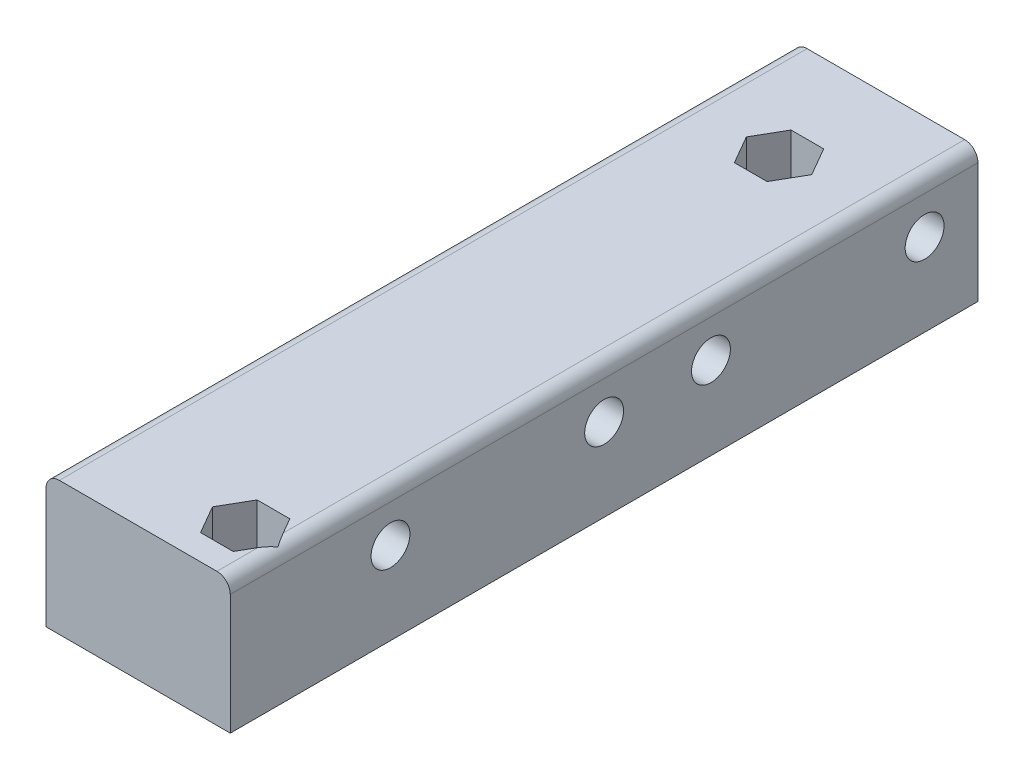
ISO-10303-21;
HEADER;
FILE_DESCRIPTION(('STEP AP214'),'2;1');
FILE_NAME('part.step','',(''),(''),'','','');
FILE_SCHEMA(('AUTOMOTIVE_DESIGN { 1 0 10303 214 1 1 1 1 }'));
ENDSEC;
DATA;
#1=APPLICATION_CONTEXT('core data for automotive mechanical design processes');
#2=APPLICATION_PROTOCOL_DEFINITION('international standard','automotive_design',2000,#1);
#3=PRODUCT_CONTEXT('',#1,'mechanical');
#4=PRODUCT('Part','Part','',(#3));
#5=PRODUCT_RELATED_PRODUCT_CATEGORY('part','',(#4));
#6=PRODUCT_DEFINITION_FORMATION('','',#4);
#7=PRODUCT_DEFINITION_CONTEXT('part definition',#1,'design');
#8=PRODUCT_DEFINITION('design','',#6,#7);
#9=PRODUCT_DEFINITION_SHAPE('','',#8);
#10=(LENGTH_UNIT() NAMED_UNIT(*) SI_UNIT(.MILLI.,.METRE.));
#11=(NAMED_UNIT(*) PLANE_ANGLE_UNIT() SI_UNIT($,.RADIAN.));
#12=(NAMED_UNIT(*) SI_UNIT($,.STERADIAN.) SOLID_ANGLE_UNIT());
#13=UNCERTAINTY_MEASURE_WITH_UNIT(LENGTH_MEASURE(1.E-05),#10,'distance_accuracy_value','');
#14=(GEOMETRIC_REPRESENTATION_CONTEXT(3) GLOBAL_UNCERTAINTY_ASSIGNED_CONTEXT((#13)) GLOBAL_UNIT_ASSIGNED_CONTEXT((#10,
#11,#12)) REPRESENTATION_CONTEXT('',''));
#15=CARTESIAN_POINT('',(0.,0.,0.));
#16=DIRECTION('',(0.,0.,1.));
#17=DIRECTION('',(1.,0.,0.));
#18=AXIS2_PLACEMENT_3D('',#15,#16,#17);
#19=CARTESIAN_POINT('',(0.,15.875,101.6));
#20=DIRECTION('',(0.,-1.,0.));
#21=DIRECTION('',(0.,0.,-1.));
#22=AXIS2_PLACEMENT_3D('',#19,#20,#21);
#23=PLANE('',#22);
#24=DIRECTION('',(-0.5,0.,-0.866025403784438));
#25=VECTOR('',#24,1.);
#26=CARTESIAN_POINT('',(12.896822330935,15.875,22.0345000000065));
#27=LINE('',#26,#25);
#28=CARTESIAN_POINT('',(14.8398946618927,15.875,25.4000000000065));
#29=VERTEX_POINT('',#28);
#30=CARTESIAN_POINT('',(12.896822330935,15.875,22.0345000000065));
#31=VERTEX_POINT('',#30);
#32=EDGE_CURVE('E316',#29,#31,#27,.T.);
#33=ORIENTED_EDGE('',*,*,#32,.F.);
#34=DIRECTION('',(0.5,0.,-0.866025403784439));
#35=VECTOR('',#34,1.);
#36=CARTESIAN_POINT('',(14.8398946618927,15.875,25.4000000000065));
#37=LINE('',#36,#35);
#38=CARTESIAN_POINT('',(12.896822330935,15.875,28.7655000000065));
#39=VERTEX_POINT('',#38);
#40=EDGE_CURVE('E311',#39,#29,#37,.T.);
#41=ORIENTED_EDGE('',*,*,#40,.F.);
#42=DIRECTION('',(1.,0.,0.));
#43=VECTOR('',#42,1.);
#44=CARTESIAN_POINT('',(12.896822330935,15.875,28.7655000000065));
#45=LINE('',#44,#43);
#46=CARTESIAN_POINT('',(9.01067766901965,15.875,28.7655000000065));
#47=VERTEX_POINT('',#46);
#48=EDGE_CURVE('E223',#47,#39,#45,.T.);
#49=ORIENTED_EDGE('',*,*,#48,.F.);
#50=DIRECTION('',(0.5,0.,0.866025403784439));
#51=VECTOR('',#50,1.);
#52=CARTESIAN_POINT('',(9.01067766901965,15.875,28.7655000000065));
#53=LINE('',#52,#51);
#54=CARTESIAN_POINT('',(7.06760533806197,15.875,25.4000000000065));
#55=VERTEX_POINT('',#54);
#56=EDGE_CURVE('E234',#55,#47,#53,.T.);
#57=ORIENTED_EDGE('',*,*,#56,.F.);
#58=DIRECTION('',(-0.5,0.,0.866025403784439));
#59=VECTOR('',#58,1.);
#60=CARTESIAN_POINT('',(7.06760533806197,15.875,25.4000000000065));
#61=LINE('',#60,#59);
#62=CARTESIAN_POINT('',(9.01067766901965,15.875,22.0345000000065));
#63=VERTEX_POINT('',#62);
#64=EDGE_CURVE('E325',#63,#55,#61,.T.);
#65=ORIENTED_EDGE('',*,*,#64,.F.);
#66=DIRECTION('',(-1.,0.,0.));
#67=VECTOR('',#66,1.);
#68=CARTESIAN_POINT('',(9.01067766901965,15.875,22.0345000000065));
#69=LINE('',#68,#67);
#70=EDGE_CURVE('E317',#31,#63,#69,.T.);
#71=ORIENTED_EDGE('',*,*,#70,.F.);
#72=EDGE_LOOP('',(#33,#41,#49,#57,#65,#71));
#73=FACE_BOUND('',#72,.T.);
#74=DIRECTION('',(1.,0.,0.));
#75=VECTOR('',#74,1.);
#76=CARTESIAN_POINT('',(21.9075,15.875,12.7));
#77=LINE('',#76,#75);
#78=CARTESIAN_POINT('',(1.5875,15.875,12.7));
#79=VERTEX_POINT('',#78);
#80=CARTESIAN_POINT('',(20.32,15.875,12.7));
#81=VERTEX_POINT('',#80);
#82=EDGE_CURVE('E217',#79,#81,#77,.T.);
#83=ORIENTED_EDGE('',*,*,#82,.F.);
#84=DIRECTION('',(0.,0.,-1.));
#85=VECTOR('',#84,1.);
#86=CARTESIAN_POINT('',(1.5875,15.875,101.6));
#87=LINE('',#86,#85);
#88=CARTESIAN_POINT('',(1.5875,15.875,101.6));
#89=VERTEX_POINT('',#88);
#90=EDGE_CURVE('E194',#79,#89,#87,.F.);
#91=ORIENTED_EDGE('',*,*,#90,.T.);
#92=DIRECTION('',(-1.,0.,0.));
#93=VECTOR('',#92,1.);
#94=CARTESIAN_POINT('',(0.,15.875,101.6));
#95=LINE('',#94,#93);
#96=CARTESIAN_POINT('',(20.32,15.875,101.6));
#97=VERTEX_POINT('',#96);
#98=EDGE_CURVE('E186',#97,#89,#95,.T.);
#99=ORIENTED_EDGE('',*,*,#98,.F.);
#100=DIRECTION('',(0.,0.,-1.));
#101=VECTOR('',#100,1.);
#102=CARTESIAN_POINT('',(20.32,15.875,101.6));
#103=LINE('',#102,#101);
#104=CARTESIAN_POINT('',(20.32,15.875,96.7300317515454));
#105=VERTEX_POINT('',#104);
#106=EDGE_CURVE('E199',#97,#105,#103,.T.);
#107=ORIENTED_EDGE('',*,*,#106,.T.);
#108=DIRECTION('',(0.5,0.,-0.866025403784439));
#109=VECTOR('',#108,1.);
#110=CARTESIAN_POINT('',(21.1898946618799,15.875,95.2233299999364));
#111=LINE('',#110,#109);
#112=CARTESIAN_POINT('',(19.2468223309222,15.875,98.5888299999364));
#113=VERTEX_POINT('',#112);
#114=EDGE_CURVE('E242',#113,#105,#111,.T.);
#115=ORIENTED_EDGE('',*,*,#114,.F.);
#116=DIRECTION('',(1.,0.,0.));
#117=VECTOR('',#116,1.);
#118=CARTESIAN_POINT('',(19.2468223309222,15.875,98.5888299999364));
#119=LINE('',#118,#117);
#120=CARTESIAN_POINT('',(15.3606776690069,15.875,98.5888299999364));
#121=VERTEX_POINT('',#120);
#122=EDGE_CURVE('E264',#121,#113,#119,.T.);
#123=ORIENTED_EDGE('',*,*,#122,.F.);
#124=DIRECTION('',(0.500000000000001,0.,0.866025403784438));
#125=VECTOR('',#124,1.);
#126=CARTESIAN_POINT('',(15.3606776690069,15.875,98.5888299999364));
#127=LINE('',#126,#125);
#128=CARTESIAN_POINT('',(13.4176053380492,15.875,95.2233299999365));
#129=VERTEX_POINT('',#128);
#130=EDGE_CURVE('E229',#129,#121,#127,.T.);
#131=ORIENTED_EDGE('',*,*,#130,.F.);
#132=DIRECTION('',(-0.5,0.,0.866025403784439));
#133=VECTOR('',#132,1.);
#134=CARTESIAN_POINT('',(13.4176053380492,15.875,95.2233299999365));
#135=LINE('',#134,#133);
#136=CARTESIAN_POINT('',(15.3606776690069,15.875,91.8578299999364));
#137=VERTEX_POINT('',#136);
#138=EDGE_CURVE('E232',#137,#129,#135,.T.);
#139=ORIENTED_EDGE('',*,*,#138,.F.);
#140=DIRECTION('',(-1.,0.,0.));
#141=VECTOR('',#140,1.);
#142=CARTESIAN_POINT('',(15.3606776690069,15.875,91.8578299999364));
#143=LINE('',#142,#141);
#144=CARTESIAN_POINT('',(19.2468223309222,15.875,91.8578299999364));
#145=VERTEX_POINT('',#144);
#146=EDGE_CURVE('E233',#145,#137,#143,.T.);
#147=ORIENTED_EDGE('',*,*,#146,.F.);
#148=DIRECTION('',(-0.5,0.,-0.866025403784439));
#149=VECTOR('',#148,1.);
#150=CARTESIAN_POINT('',(19.2468223309222,15.875,91.8578299999364));
#151=LINE('',#150,#149);
#152=CARTESIAN_POINT('',(20.32,15.875,93.7166282483275));
#153=VERTEX_POINT('',#152);
#154=EDGE_CURVE('E236',#153,#145,#151,.T.);
#155=ORIENTED_EDGE('',*,*,#154,.F.);
#156=EDGE_CURVE('E200',#153,#81,#103,.T.);
#157=ORIENTED_EDGE('',*,*,#156,.T.);
#158=EDGE_LOOP('',(#83,#91,#99,#107,#115,#123,#131,#139,#147,#155,#157));
#159=FACE_BOUND('',#158,.T.);
#160=ADVANCED_FACE('F39',(#73,#159),#23,.F.);
#161=CARTESIAN_POINT('',(0.,0.,101.6));
#162=DIRECTION('',(1.,0.,0.));
#163=DIRECTION('',(0.,0.,-1.));
#164=AXIS2_PLACEMENT_3D('',#161,#162,#163);
#165=PLANE('',#164);
#166=CARTESIAN_POINT('',(0.,9.82980000007019,19.0500000000115));
#167=DIRECTION('',(1.,0.,0.));
#168=DIRECTION('',(0.,0.,-1.));
#169=AXIS2_PLACEMENT_3D('',#166,#167,#168);
#170=CIRCLE('',#169,2.31139999999998);
#171=CARTESIAN_POINT('',(0.,9.82980000007019,16.7386000000115));
#172=VERTEX_POINT('',#171);
#173=EDGE_CURVE('E347',#172,#172,#170,.F.);
#174=ORIENTED_EDGE('',*,*,#173,.F.);
#175=EDGE_LOOP('',(#174));
#176=FACE_BOUND('',#175,.T.);
#177=CARTESIAN_POINT('',(0.,9.82980000007019,82.5500000000114));
#178=DIRECTION('',(1.,0.,0.));
#179=DIRECTION('',(0.,0.,-1.));
#180=AXIS2_PLACEMENT_3D('',#177,#178,#179);
#181=CIRCLE('',#180,2.3114);
#182=CARTESIAN_POINT('',(0.,9.82980000007019,80.2386000000114));
#183=VERTEX_POINT('',#182);
#184=EDGE_CURVE('E278',#183,#183,#181,.F.);
#185=ORIENTED_EDGE('',*,*,#184,.F.);
#186=EDGE_LOOP('',(#185));
#187=FACE_BOUND('',#186,.T.);
#188=CARTESIAN_POINT('',(0.,9.82980000007019,44.4500000000115));
#189=DIRECTION('',(1.,0.,0.));
#190=DIRECTION('',(0.,0.,-1.));
#191=AXIS2_PLACEMENT_3D('',#188,#189,#190);
#192=CIRCLE('',#191,2.31139999999998);
#193=CARTESIAN_POINT('',(0.,9.82980000007019,42.1386000000115));
#194=VERTEX_POINT('',#193);
#195=EDGE_CURVE('E332',#194,#194,#192,.F.);
#196=ORIENTED_EDGE('',*,*,#195,.F.);
#197=EDGE_LOOP('',(#196));
#198=FACE_BOUND('',#197,.T.);
#199=CARTESIAN_POINT('',(0.,9.82980000007019,57.1500000000115));
#200=DIRECTION('',(1.,0.,0.));
#201=DIRECTION('',(0.,0.,-1.));
#202=AXIS2_PLACEMENT_3D('',#199,#200,#201);
#203=CIRCLE('',#202,2.31139999999998);
#204=CARTESIAN_POINT('',(0.,9.82980000007019,54.8386000000115));
#205=VERTEX_POINT('',#204);
#206=EDGE_CURVE('E335',#205,#205,#203,.F.);
#207=ORIENTED_EDGE('',*,*,#206,.F.);
#208=EDGE_LOOP('',(#207));
#209=FACE_BOUND('',#208,.T.);
#210=DIRECTION('',(0.,1.,0.));
#211=VECTOR('',#210,1.);
#212=CARTESIAN_POINT('',(0.,0.,12.7));
#213=LINE('',#212,#211);
#214=CARTESIAN_POINT('',(0.,0.,12.7));
#215=VERTEX_POINT('',#214);
#216=CARTESIAN_POINT('',(0.,14.2875,12.7));
#217=VERTEX_POINT('',#216);
#218=EDGE_CURVE('E52',#215,#217,#213,.T.);
#219=ORIENTED_EDGE('',*,*,#218,.F.);
#220=DIRECTION('',(0.,0.,-1.));
#221=VECTOR('',#220,1.);
#222=CARTESIAN_POINT('',(0.,0.,101.6));
#223=LINE('',#222,#221);
#224=CARTESIAN_POINT('',(0.,0.,101.6));
#225=VERTEX_POINT('',#224);
#226=EDGE_CURVE('E183',#225,#215,#223,.T.);
#227=ORIENTED_EDGE('',*,*,#226,.F.);
#228=DIRECTION('',(0.,-1.,0.));
#229=VECTOR('',#228,1.);
#230=CARTESIAN_POINT('',(0.,0.,101.6));
#231=LINE('',#230,#229);
#232=CARTESIAN_POINT('',(0.,14.2875,101.6));
#233=VERTEX_POINT('',#232);
#234=EDGE_CURVE('E213',#233,#225,#231,.T.);
#235=ORIENTED_EDGE('',*,*,#234,.F.);
#236=DIRECTION('',(0.,0.,-1.));
#237=VECTOR('',#236,1.);
#238=CARTESIAN_POINT('',(0.,14.2875,101.6));
#239=LINE('',#238,#237);
#240=EDGE_CURVE('E50',#233,#217,#239,.T.);
#241=ORIENTED_EDGE('',*,*,#240,.T.);
#242=EDGE_LOOP('',(#219,#227,#235,#241));
#243=FACE_BOUND('',#242,.T.);
#244=ADVANCED_FACE('F215',(#176,#187,#198,#209,#243),#165,.F.);
#245=CARTESIAN_POINT('',(0.,0.,101.6));
#246=DIRECTION('',(0.,1.,0.));
#247=DIRECTION('',(0.,0.,1.));
#248=AXIS2_PLACEMENT_3D('',#245,#246,#247);
#249=PLANE('',#248);
#250=DIRECTION('',(-1.,0.,0.));
#251=VECTOR('',#250,1.);
#252=CARTESIAN_POINT('',(12.896822330935,0.,28.7655000000065));
#253=LINE('',#252,#251);
#254=CARTESIAN_POINT('',(12.896822330935,0.,28.7655000000065));
#255=VERTEX_POINT('',#254);
#256=CARTESIAN_POINT('',(9.01067766901965,0.,28.7655000000065));
#257=VERTEX_POINT('',#256);
#258=EDGE_CURVE('E306',#255,#257,#253,.T.);
#259=ORIENTED_EDGE('',*,*,#258,.F.);
#260=DIRECTION('',(-0.5,0.,0.866025403784439));
#261=VECTOR('',#260,1.);
#262=CARTESIAN_POINT('',(14.8398946618927,0.,25.4000000000065));
#263=LINE('',#262,#261);
#264=CARTESIAN_POINT('',(14.8398946618927,0.,25.4000000000065));
#265=VERTEX_POINT('',#264);
#266=EDGE_CURVE('E313',#265,#255,#263,.T.);
#267=ORIENTED_EDGE('',*,*,#266,.F.);
#268=DIRECTION('',(0.5,0.,0.866025403784438));
#269=VECTOR('',#268,1.);
#270=CARTESIAN_POINT('',(12.896822330935,0.,22.0345000000065));
#271=LINE('',#270,#269);
#272=CARTESIAN_POINT('',(12.896822330935,0.,22.0345000000065));
#273=VERTEX_POINT('',#272);
#274=EDGE_CURVE('E289',#273,#265,#271,.T.);
#275=ORIENTED_EDGE('',*,*,#274,.F.);
#276=DIRECTION('',(1.,0.,0.));
#277=VECTOR('',#276,1.);
#278=CARTESIAN_POINT('',(9.01067766901965,0.,22.0345000000065));
#279=LINE('',#278,#277);
#280=CARTESIAN_POINT('',(9.01067766901965,0.,22.0345000000065));
#281=VERTEX_POINT('',#280);
#282=EDGE_CURVE('E299',#281,#273,#279,.T.);
#283=ORIENTED_EDGE('',*,*,#282,.F.);
#284=DIRECTION('',(0.5,0.,-0.866025403784439));
#285=VECTOR('',#284,1.);
#286=CARTESIAN_POINT('',(7.06760533806197,0.,25.4000000000065));
#287=LINE('',#286,#285);
#288=CARTESIAN_POINT('',(7.06760533806197,0.,25.4000000000065));
#289=VERTEX_POINT('',#288);
#290=EDGE_CURVE('E304',#289,#281,#287,.T.);
#291=ORIENTED_EDGE('',*,*,#290,.F.);
#292=DIRECTION('',(-0.5,0.,-0.866025403784439));
#293=VECTOR('',#292,1.);
#294=CARTESIAN_POINT('',(9.01067766901965,0.,28.7655000000065));
#295=LINE('',#294,#293);
#296=EDGE_CURVE('E303',#257,#289,#295,.T.);
#297=ORIENTED_EDGE('',*,*,#296,.F.);
#298=EDGE_LOOP('',(#259,#267,#275,#283,#291,#297));
#299=FACE_BOUND('',#298,.T.);
#300=DIRECTION('',(0.5,0.,0.866025403784439));
#301=VECTOR('',#300,1.);
#302=CARTESIAN_POINT('',(19.2468223309222,0.,91.8578299999364));
#303=LINE('',#302,#301);
#304=CARTESIAN_POINT('',(19.2468223309222,0.,91.8578299999364));
#305=VERTEX_POINT('',#304);
#306=CARTESIAN_POINT('',(21.1898946618799,0.,95.2233299999364));
#307=VERTEX_POINT('',#306);
#308=EDGE_CURVE('E259',#305,#307,#303,.T.);
#309=ORIENTED_EDGE('',*,*,#308,.F.);
#310=DIRECTION('',(1.,0.,0.));
#311=VECTOR('',#310,1.);
#312=CARTESIAN_POINT('',(15.3606776690069,0.,91.8578299999364));
#313=LINE('',#312,#311);
#314=CARTESIAN_POINT('',(15.3606776690069,0.,91.8578299999364));
#315=VERTEX_POINT('',#314);
#316=EDGE_CURVE('E62',#315,#305,#313,.T.);
#317=ORIENTED_EDGE('',*,*,#316,.F.);
#318=DIRECTION('',(0.499999999999999,0.,-0.866025403784439));
#319=VECTOR('',#318,1.);
#320=CARTESIAN_POINT('',(13.4176053380492,0.,95.2233299999365));
#321=LINE('',#320,#319);
#322=CARTESIAN_POINT('',(13.4176053380492,0.,95.2233299999365));
#323=VERTEX_POINT('',#322);
#324=EDGE_CURVE('E254',#323,#315,#321,.T.);
#325=ORIENTED_EDGE('',*,*,#324,.F.);
#326=DIRECTION('',(-0.500000000000001,0.,-0.866025403784438));
#327=VECTOR('',#326,1.);
#328=CARTESIAN_POINT('',(15.3606776690069,0.,98.5888299999364));
#329=LINE('',#328,#327);
#330=CARTESIAN_POINT('',(15.3606776690069,0.,98.5888299999364));
#331=VERTEX_POINT('',#330);
#332=EDGE_CURVE('E252',#331,#323,#329,.T.);
#333=ORIENTED_EDGE('',*,*,#332,.F.);
#334=DIRECTION('',(-1.,0.,0.));
#335=VECTOR('',#334,1.);
#336=CARTESIAN_POINT('',(19.2468223309222,0.,98.5888299999364));
#337=LINE('',#336,#335);
#338=CARTESIAN_POINT('',(19.2468223309222,0.,98.5888299999364));
#339=VERTEX_POINT('',#338);
#340=EDGE_CURVE('E246',#339,#331,#337,.T.);
#341=ORIENTED_EDGE('',*,*,#340,.F.);
#342=DIRECTION('',(-0.5,0.,0.866025403784439));
#343=VECTOR('',#342,1.);
#344=CARTESIAN_POINT('',(21.1898946618799,0.,95.2233299999364));
#345=LINE('',#344,#343);
#346=EDGE_CURVE('E247',#307,#339,#345,.T.);
#347=ORIENTED_EDGE('',*,*,#346,.F.);
#348=EDGE_LOOP('',(#309,#317,#325,#333,#341,#347));
#349=FACE_BOUND('',#348,.T.);
#350=DIRECTION('',(-1.,0.,0.));
#351=VECTOR('',#350,1.);
#352=CARTESIAN_POINT('',(21.9075,0.,12.7));
#353=LINE('',#352,#351);
#354=CARTESIAN_POINT('',(21.9075,0.,12.7));
#355=VERTEX_POINT('',#354);
#356=EDGE_CURVE('E168',#355,#215,#353,.T.);
#357=ORIENTED_EDGE('',*,*,#356,.F.);
#358=DIRECTION('',(0.,0.,-1.));
#359=VECTOR('',#358,1.);
#360=CARTESIAN_POINT('',(21.9075,0.,101.6));
#361=LINE('',#360,#359);
#362=CARTESIAN_POINT('',(21.9075,0.,101.6));
#363=VERTEX_POINT('',#362);
#364=EDGE_CURVE('E185',#363,#355,#361,.T.);
#365=ORIENTED_EDGE('',*,*,#364,.F.);
#366=DIRECTION('',(1.,0.,0.));
#367=VECTOR('',#366,1.);
#368=CARTESIAN_POINT('',(0.,0.,101.6));
#369=LINE('',#368,#367);
#370=EDGE_CURVE('E348',#225,#363,#369,.T.);
#371=ORIENTED_EDGE('',*,*,#370,.F.);
#372=ORIENTED_EDGE('',*,*,#226,.T.);
#373=EDGE_LOOP('',(#357,#365,#371,#372));
#374=FACE_BOUND('',#373,.T.);
#375=ADVANCED_FACE('F178',(#299,#349,#374),#249,.F.);
#376=CARTESIAN_POINT('',(21.9075,0.,101.6));
#377=DIRECTION('',(-1.,0.,0.));
#378=DIRECTION('',(0.,0.,1.));
#379=AXIS2_PLACEMENT_3D('',#376,#377,#378);
#380=PLANE('',#379);
#381=CARTESIAN_POINT('',(21.9075,9.82980000007019,19.0500000000115));
#382=DIRECTION('',(1.,0.,0.));
#383=DIRECTION('',(0.,0.,-1.));
#384=AXIS2_PLACEMENT_3D('',#381,#382,#383);
#385=CIRCLE('',#384,2.31139999999998);
#386=CARTESIAN_POINT('',(21.9075,9.82980000007019,16.7386000000115));
#387=VERTEX_POINT('',#386);
#388=EDGE_CURVE('E339',#387,#387,#385,.T.);
#389=ORIENTED_EDGE('',*,*,#388,.F.);
#390=EDGE_LOOP('',(#389));
#391=FACE_BOUND('',#390,.T.);
#392=CARTESIAN_POINT('',(21.9075,9.82980000007019,82.5500000000114));
#393=DIRECTION('',(1.,0.,0.));
#394=DIRECTION('',(0.,0.,-1.));
#395=AXIS2_PLACEMENT_3D('',#392,#393,#394);
#396=CIRCLE('',#395,2.3114);
#397=CARTESIAN_POINT('',(21.9075,9.82980000007019,80.2386000000114));
#398=VERTEX_POINT('',#397);
#399=EDGE_CURVE('E327',#398,#398,#396,.T.);
#400=ORIENTED_EDGE('',*,*,#399,.F.);
#401=EDGE_LOOP('',(#400));
#402=FACE_BOUND('',#401,.T.);
#403=CARTESIAN_POINT('',(21.9075,9.82980000007019,44.4500000000115));
#404=DIRECTION('',(1.,0.,0.));
#405=DIRECTION('',(0.,0.,-1.));
#406=AXIS2_PLACEMENT_3D('',#403,#404,#405);
#407=CIRCLE('',#406,2.31139999999998);
#408=CARTESIAN_POINT('',(21.9075,9.82980000007019,42.1386000000115));
#409=VERTEX_POINT('',#408);
#410=EDGE_CURVE('E337',#409,#409,#407,.T.);
#411=ORIENTED_EDGE('',*,*,#410,.F.);
#412=EDGE_LOOP('',(#411));
#413=FACE_BOUND('',#412,.T.);
#414=CARTESIAN_POINT('',(21.9075,9.82980000007019,57.1500000000115));
#415=DIRECTION('',(1.,0.,0.));
#416=DIRECTION('',(0.,0.,-1.));
#417=AXIS2_PLACEMENT_3D('',#414,#415,#416);
#418=CIRCLE('',#417,2.31139999999998);
#419=CARTESIAN_POINT('',(21.9075,9.82980000007019,54.8386000000115));
#420=VERTEX_POINT('',#419);
#421=EDGE_CURVE('E333',#420,#420,#418,.T.);
#422=ORIENTED_EDGE('',*,*,#421,.F.);
#423=EDGE_LOOP('',(#422));
#424=FACE_BOUND('',#423,.T.);
#425=DIRECTION('',(0.,-1.,0.));
#426=VECTOR('',#425,1.);
#427=CARTESIAN_POINT('',(21.9075,0.,12.7));
#428=LINE('',#427,#426);
#429=CARTESIAN_POINT('',(21.9075,14.2875,12.7));
#430=VERTEX_POINT('',#429);
#431=EDGE_CURVE('E170',#430,#355,#428,.T.);
#432=ORIENTED_EDGE('',*,*,#431,.F.);
#433=DIRECTION('',(0.,0.,-1.));
#434=VECTOR('',#433,1.);
#435=CARTESIAN_POINT('',(21.9075,14.2875,101.6));
#436=LINE('',#435,#434);
#437=CARTESIAN_POINT('',(21.9075,14.2875,101.6));
#438=VERTEX_POINT('',#437);
#439=EDGE_CURVE('E201',#430,#438,#436,.F.);
#440=ORIENTED_EDGE('',*,*,#439,.T.);
#441=DIRECTION('',(0.,1.,0.));
#442=VECTOR('',#441,1.);
#443=CARTESIAN_POINT('',(21.9075,0.,101.6));
#444=LINE('',#443,#442);
#445=EDGE_CURVE('E189',#363,#438,#444,.T.);
#446=ORIENTED_EDGE('',*,*,#445,.F.);
#447=ORIENTED_EDGE('',*,*,#364,.T.);
#448=EDGE_LOOP('',(#432,#440,#446,#447));
#449=FACE_BOUND('',#448,.T.);
#450=ADVANCED_FACE('F190',(#391,#402,#413,#424,#449),#380,.F.);
#451=CARTESIAN_POINT('',(20.32,14.2875,101.6));
#452=DIRECTION('',(0.,0.,-1.));
#453=DIRECTION('',(-1.,0.,0.));
#454=AXIS2_PLACEMENT_3D('',#451,#452,#453);
#455=CYLINDRICAL_SURFACE('',#454,1.5875);
#456=CARTESIAN_POINT('',(20.32,14.2875,12.7));
#457=DIRECTION('',(0.,0.,1.));
#458=DIRECTION('',(1.,0.,0.));
#459=AXIS2_PLACEMENT_3D('',#456,#457,#458);
#460=CIRCLE('',#459,1.5875);
#461=EDGE_CURVE('E175',#81,#430,#460,.F.);
#462=ORIENTED_EDGE('',*,*,#461,.F.);
#463=ORIENTED_EDGE('',*,*,#156,.F.);
#464=CARTESIAN_POINT('',(20.32,14.2875,93.7166282483275));
#465=DIRECTION('',(0.866025403784439,0.,-0.5));
#466=DIRECTION('',(-0.5,0.,-0.866025403784439));
#467=AXIS2_PLACEMENT_3D('',#464,#465,#466);
#468=ELLIPSE('',#467,3.175,1.5875);
#469=CARTESIAN_POINT('',(21.1898946618799,15.6154456040188,95.2233299999364));
#470=VERTEX_POINT('',#469);
#471=EDGE_CURVE('E280',#153,#470,#468,.T.);
#472=ORIENTED_EDGE('',*,*,#471,.T.);
#473=CARTESIAN_POINT('',(20.32,14.2875,96.7300317515454));
#474=DIRECTION('',(0.866025403784439,0.,0.5));
#475=DIRECTION('',(0.5,0.,-0.866025403784439));
#476=AXIS2_PLACEMENT_3D('',#473,#474,#475);
#477=ELLIPSE('',#476,3.175,1.5875);
#478=EDGE_CURVE('E243',#470,#105,#477,.T.);
#479=ORIENTED_EDGE('',*,*,#478,.T.);
#480=ORIENTED_EDGE('',*,*,#106,.F.);
#481=CARTESIAN_POINT('',(20.32,14.2875,101.6));
#482=DIRECTION('',(0.,0.,-1.));
#483=DIRECTION('',(-1.,0.,0.));
#484=AXIS2_PLACEMENT_3D('',#481,#482,#483);
#485=CIRCLE('',#484,1.5875);
#486=EDGE_CURVE('E210',#438,#97,#485,.F.);
#487=ORIENTED_EDGE('',*,*,#486,.F.);
#488=ORIENTED_EDGE('',*,*,#439,.F.);
#489=EDGE_LOOP('',(#462,#463,#472,#479,#480,#487,#488));
#490=FACE_BOUND('',#489,.T.);
#491=ADVANCED_FACE('F357',(#490),#455,.T.);
#492=CARTESIAN_POINT('',(0.,0.,101.6));
#493=DIRECTION('',(0.,0.,-1.));
#494=DIRECTION('',(-1.,0.,0.));
#495=AXIS2_PLACEMENT_3D('',#492,#493,#494);
#496=PLANE('',#495);
#497=ORIENTED_EDGE('',*,*,#445,.T.);
#498=ORIENTED_EDGE('',*,*,#486,.T.);
#499=ORIENTED_EDGE('',*,*,#98,.T.);
#500=CARTESIAN_POINT('',(1.5875,14.2875,101.6));
#501=DIRECTION('',(0.,0.,-1.));
#502=DIRECTION('',(-1.,0.,0.));
#503=AXIS2_PLACEMENT_3D('',#500,#501,#502);
#504=CIRCLE('',#503,1.5875);
#505=EDGE_CURVE('E202',#89,#233,#504,.F.);
#506=ORIENTED_EDGE('',*,*,#505,.T.);
#507=ORIENTED_EDGE('',*,*,#234,.T.);
#508=ORIENTED_EDGE('',*,*,#370,.T.);
#509=EDGE_LOOP('',(#497,#498,#499,#506,#507,#508));
#510=FACE_BOUND('',#509,.T.);
#511=ADVANCED_FACE('F353',(#510),#496,.F.);
#512=CARTESIAN_POINT('',(1.5875,14.2875,101.6));
#513=DIRECTION('',(0.,0.,-1.));
#514=DIRECTION('',(-1.,0.,0.));
#515=AXIS2_PLACEMENT_3D('',#512,#513,#514);
#516=CYLINDRICAL_SURFACE('',#515,1.5875);
#517=CARTESIAN_POINT('',(1.5875,14.2875,12.7));
#518=DIRECTION('',(0.,0.,1.));
#519=DIRECTION('',(1.,0.,0.));
#520=AXIS2_PLACEMENT_3D('',#517,#518,#519);
#521=CIRCLE('',#520,1.5875);
#522=EDGE_CURVE('E11',#217,#79,#521,.F.);
#523=ORIENTED_EDGE('',*,*,#522,.F.);
#524=ORIENTED_EDGE('',*,*,#240,.F.);
#525=ORIENTED_EDGE('',*,*,#505,.F.);
#526=ORIENTED_EDGE('',*,*,#90,.F.);
#527=EDGE_LOOP('',(#523,#524,#525,#526));
#528=FACE_BOUND('',#527,.T.);
#529=ADVANCED_FACE('F41',(#528),#516,.T.);
#530=CARTESIAN_POINT('',(-6.53762645613833,9.82980000007019,19.0500000000115));
#531=DIRECTION('',(1.,0.,0.));
#532=DIRECTION('',(0.,0.,-1.));
#533=AXIS2_PLACEMENT_3D('',#530,#531,#532);
#534=CYLINDRICAL_SURFACE('',#533,2.31139999999998);
#535=ORIENTED_EDGE('',*,*,#173,.T.);
#536=EDGE_LOOP('',(#535));
#537=FACE_BOUND('',#536,.T.);
#538=ORIENTED_EDGE('',*,*,#388,.T.);
#539=EDGE_LOOP('',(#538));
#540=FACE_BOUND('',#539,.T.);
#541=ADVANCED_FACE('F401',(#537,#540),#534,.F.);
#542=CARTESIAN_POINT('',(-6.53762645613833,9.82980000007019,82.5500000000114));
#543=DIRECTION('',(1.,0.,0.));
#544=DIRECTION('',(0.,0.,-1.));
#545=AXIS2_PLACEMENT_3D('',#542,#543,#544);
#546=CYLINDRICAL_SURFACE('',#545,2.3114);
#547=ORIENTED_EDGE('',*,*,#184,.T.);
#548=EDGE_LOOP('',(#547));
#549=FACE_BOUND('',#548,.T.);
#550=ORIENTED_EDGE('',*,*,#399,.T.);
#551=EDGE_LOOP('',(#550));
#552=FACE_BOUND('',#551,.T.);
#553=ADVANCED_FACE('F407',(#549,#552),#546,.F.);
#554=CARTESIAN_POINT('',(-6.53762645613833,9.82980000007019,44.4500000000115));
#555=DIRECTION('',(1.,0.,0.));
#556=DIRECTION('',(0.,0.,-1.));
#557=AXIS2_PLACEMENT_3D('',#554,#555,#556);
#558=CYLINDRICAL_SURFACE('',#557,2.31139999999998);
#559=ORIENTED_EDGE('',*,*,#195,.T.);
#560=EDGE_LOOP('',(#559));
#561=FACE_BOUND('',#560,.T.);
#562=ORIENTED_EDGE('',*,*,#410,.T.);
#563=EDGE_LOOP('',(#562));
#564=FACE_BOUND('',#563,.T.);
#565=ADVANCED_FACE('F408',(#561,#564),#558,.F.);
#566=CARTESIAN_POINT('',(-6.53762645613833,9.82980000007019,57.1500000000115));
#567=DIRECTION('',(1.,0.,0.));
#568=DIRECTION('',(0.,0.,-1.));
#569=AXIS2_PLACEMENT_3D('',#566,#567,#568);
#570=CYLINDRICAL_SURFACE('',#569,2.31139999999998);
#571=ORIENTED_EDGE('',*,*,#206,.T.);
#572=EDGE_LOOP('',(#571));
#573=FACE_BOUND('',#572,.T.);
#574=ORIENTED_EDGE('',*,*,#421,.T.);
#575=EDGE_LOOP('',(#574));
#576=FACE_BOUND('',#575,.T.);
#577=ADVANCED_FACE('F412',(#573,#576),#570,.F.);
#578=CARTESIAN_POINT('',(14.8398946618927,15.876,25.4000000000065));
#579=DIRECTION('',(0.866025403784439,0.,0.5));
#580=DIRECTION('',(0.5,0.,-0.866025403784439));
#581=AXIS2_PLACEMENT_3D('',#578,#579,#580);
#582=PLANE('',#581);
#583=ORIENTED_EDGE('',*,*,#40,.T.);
#584=DIRECTION('',(0.,-1.,0.));
#585=VECTOR('',#584,1.);
#586=CARTESIAN_POINT('',(14.8398946618927,15.876,25.4000000000065));
#587=LINE('',#586,#585);
#588=EDGE_CURVE('E283',#29,#265,#587,.T.);
#589=ORIENTED_EDGE('',*,*,#588,.T.);
#590=ORIENTED_EDGE('',*,*,#266,.T.);
#591=DIRECTION('',(0.,-1.,0.));
#592=VECTOR('',#591,1.);
#593=CARTESIAN_POINT('',(12.896822330935,15.876,28.7655000000065));
#594=LINE('',#593,#592);
#595=EDGE_CURVE('E284',#39,#255,#594,.T.);
#596=ORIENTED_EDGE('',*,*,#595,.F.);
#597=EDGE_LOOP('',(#583,#589,#590,#596));
#598=FACE_BOUND('',#597,.T.);
#599=ADVANCED_FACE('F413',(#598),#582,.F.);
#600=CARTESIAN_POINT('',(12.896822330935,15.876,22.0345000000065));
#601=DIRECTION('',(0.866025403784438,0.,-0.5));
#602=DIRECTION('',(-0.5,0.,-0.866025403784438));
#603=AXIS2_PLACEMENT_3D('',#600,#601,#602);
#604=PLANE('',#603);
#605=ORIENTED_EDGE('',*,*,#32,.T.);
#606=DIRECTION('',(0.,-1.,0.));
#607=VECTOR('',#606,1.);
#608=CARTESIAN_POINT('',(12.896822330935,15.876,22.0345000000065));
#609=LINE('',#608,#607);
#610=EDGE_CURVE('E294',#31,#273,#609,.T.);
#611=ORIENTED_EDGE('',*,*,#610,.T.);
#612=ORIENTED_EDGE('',*,*,#274,.T.);
#613=ORIENTED_EDGE('',*,*,#588,.F.);
#614=EDGE_LOOP('',(#605,#611,#612,#613));
#615=FACE_BOUND('',#614,.T.);
#616=ADVANCED_FACE('F419',(#615),#604,.F.);
#617=CARTESIAN_POINT('',(9.01067766901965,15.876,22.0345000000065));
#618=DIRECTION('',(0.,0.,-1.));
#619=DIRECTION('',(-1.,0.,0.));
#620=AXIS2_PLACEMENT_3D('',#617,#618,#619);
#621=PLANE('',#620);
#622=ORIENTED_EDGE('',*,*,#70,.T.);
#623=DIRECTION('',(0.,-1.,0.));
#624=VECTOR('',#623,1.);
#625=CARTESIAN_POINT('',(9.01067766901965,15.876,22.0345000000065));
#626=LINE('',#625,#624);
#627=EDGE_CURVE('E295',#63,#281,#626,.T.);
#628=ORIENTED_EDGE('',*,*,#627,.T.);
#629=ORIENTED_EDGE('',*,*,#282,.T.);
#630=ORIENTED_EDGE('',*,*,#610,.F.);
#631=EDGE_LOOP('',(#622,#628,#629,#630));
#632=FACE_BOUND('',#631,.T.);
#633=ADVANCED_FACE('F421',(#632),#621,.F.);
#634=CARTESIAN_POINT('',(7.06760533806197,15.876,25.4000000000065));
#635=DIRECTION('',(-0.866025403784439,0.,-0.5));
#636=DIRECTION('',(-0.5,0.,0.866025403784439));
#637=AXIS2_PLACEMENT_3D('',#634,#635,#636);
#638=PLANE('',#637);
#639=ORIENTED_EDGE('',*,*,#64,.T.);
#640=DIRECTION('',(0.,-1.,0.));
#641=VECTOR('',#640,1.);
#642=CARTESIAN_POINT('',(7.06760533806197,15.876,25.4000000000065));
#643=LINE('',#642,#641);
#644=EDGE_CURVE('E288',#55,#289,#643,.T.);
#645=ORIENTED_EDGE('',*,*,#644,.T.);
#646=ORIENTED_EDGE('',*,*,#290,.T.);
#647=ORIENTED_EDGE('',*,*,#627,.F.);
#648=EDGE_LOOP('',(#639,#645,#646,#647));
#649=FACE_BOUND('',#648,.T.);
#650=ADVANCED_FACE('F430',(#649),#638,.F.);
#651=CARTESIAN_POINT('',(9.01067766901965,15.876,28.7655000000065));
#652=DIRECTION('',(-0.866025403784439,0.,0.5));
#653=DIRECTION('',(0.5,0.,0.866025403784439));
#654=AXIS2_PLACEMENT_3D('',#651,#652,#653);
#655=PLANE('',#654);
#656=ORIENTED_EDGE('',*,*,#56,.T.);
#657=DIRECTION('',(0.,-1.,0.));
#658=VECTOR('',#657,1.);
#659=CARTESIAN_POINT('',(9.01067766901965,15.876,28.7655000000065));
#660=LINE('',#659,#658);
#661=EDGE_CURVE('E290',#47,#257,#660,.T.);
#662=ORIENTED_EDGE('',*,*,#661,.T.);
#663=ORIENTED_EDGE('',*,*,#296,.T.);
#664=ORIENTED_EDGE('',*,*,#644,.F.);
#665=EDGE_LOOP('',(#656,#662,#663,#664));
#666=FACE_BOUND('',#665,.T.);
#667=ADVANCED_FACE('F431',(#666),#655,.F.);
#668=CARTESIAN_POINT('',(12.896822330935,15.876,28.7655000000065));
#669=DIRECTION('',(0.,0.,1.));
#670=DIRECTION('',(1.,0.,0.));
#671=AXIS2_PLACEMENT_3D('',#668,#669,#670);
#672=PLANE('',#671);
#673=ORIENTED_EDGE('',*,*,#48,.T.);
#674=ORIENTED_EDGE('',*,*,#595,.T.);
#675=ORIENTED_EDGE('',*,*,#258,.T.);
#676=ORIENTED_EDGE('',*,*,#661,.F.);
#677=EDGE_LOOP('',(#673,#674,#675,#676));
#678=FACE_BOUND('',#677,.T.);
#679=ADVANCED_FACE('F434',(#678),#672,.F.);
#680=CARTESIAN_POINT('',(15.3606776690069,15.876,91.8578299999364));
#681=DIRECTION('',(0.,0.,-1.));
#682=DIRECTION('',(-1.,0.,0.));
#683=AXIS2_PLACEMENT_3D('',#680,#681,#682);
#684=PLANE('',#683);
#685=ORIENTED_EDGE('',*,*,#146,.T.);
#686=DIRECTION('',(0.,-1.,0.));
#687=VECTOR('',#686,1.);
#688=CARTESIAN_POINT('',(15.3606776690069,15.876,91.8578299999364));
#689=LINE('',#688,#687);
#690=EDGE_CURVE('E268',#137,#315,#689,.T.);
#691=ORIENTED_EDGE('',*,*,#690,.T.);
#692=ORIENTED_EDGE('',*,*,#316,.T.);
#693=DIRECTION('',(0.,-1.,0.));
#694=VECTOR('',#693,1.);
#695=CARTESIAN_POINT('',(19.2468223309222,15.876,91.8578299999364));
#696=LINE('',#695,#694);
#697=EDGE_CURVE('E266',#145,#305,#696,.T.);
#698=ORIENTED_EDGE('',*,*,#697,.F.);
#699=EDGE_LOOP('',(#685,#691,#692,#698));
#700=FACE_BOUND('',#699,.T.);
#701=ADVANCED_FACE('F376',(#700),#684,.F.);
#702=CARTESIAN_POINT('',(13.4176053380492,15.876,95.2233299999365));
#703=DIRECTION('',(-0.866025403784439,0.,-0.5));
#704=DIRECTION('',(-0.5,0.,0.866025403784439));
#705=AXIS2_PLACEMENT_3D('',#702,#703,#704);
#706=PLANE('',#705);
#707=ORIENTED_EDGE('',*,*,#138,.T.);
#708=DIRECTION('',(0.,-1.,0.));
#709=VECTOR('',#708,1.);
#710=CARTESIAN_POINT('',(13.4176053380492,15.876,95.2233299999365));
#711=LINE('',#710,#709);
#712=EDGE_CURVE('E269',#129,#323,#711,.T.);
#713=ORIENTED_EDGE('',*,*,#712,.T.);
#714=ORIENTED_EDGE('',*,*,#324,.T.);
#715=ORIENTED_EDGE('',*,*,#690,.F.);
#716=EDGE_LOOP('',(#707,#713,#714,#715));
#717=FACE_BOUND('',#716,.T.);
#718=ADVANCED_FACE('F374',(#717),#706,.F.);
#719=CARTESIAN_POINT('',(15.3606776690069,15.876,98.5888299999364));
#720=DIRECTION('',(-0.866025403784438,0.,0.500000000000001));
#721=DIRECTION('',(0.500000000000001,0.,0.866025403784438));
#722=AXIS2_PLACEMENT_3D('',#719,#720,#721);
#723=PLANE('',#722);
#724=ORIENTED_EDGE('',*,*,#130,.T.);
#725=DIRECTION('',(0.,-1.,0.));
#726=VECTOR('',#725,1.);
#727=CARTESIAN_POINT('',(15.3606776690069,15.876,98.5888299999364));
#728=LINE('',#727,#726);
#729=EDGE_CURVE('E275',#121,#331,#728,.T.);
#730=ORIENTED_EDGE('',*,*,#729,.T.);
#731=ORIENTED_EDGE('',*,*,#332,.T.);
#732=ORIENTED_EDGE('',*,*,#712,.F.);
#733=EDGE_LOOP('',(#724,#730,#731,#732));
#734=FACE_BOUND('',#733,.T.);
#735=ADVANCED_FACE('F367',(#734),#723,.F.);
#736=CARTESIAN_POINT('',(19.2468223309222,15.876,98.5888299999364));
#737=DIRECTION('',(0.,0.,1.));
#738=DIRECTION('',(1.,0.,0.));
#739=AXIS2_PLACEMENT_3D('',#736,#737,#738);
#740=PLANE('',#739);
#741=ORIENTED_EDGE('',*,*,#122,.T.);
#742=DIRECTION('',(0.,-1.,0.));
#743=VECTOR('',#742,1.);
#744=CARTESIAN_POINT('',(19.2468223309222,15.876,98.5888299999364));
#745=LINE('',#744,#743);
#746=EDGE_CURVE('E265',#113,#339,#745,.T.);
#747=ORIENTED_EDGE('',*,*,#746,.T.);
#748=ORIENTED_EDGE('',*,*,#340,.T.);
#749=ORIENTED_EDGE('',*,*,#729,.F.);
#750=EDGE_LOOP('',(#741,#747,#748,#749));
#751=FACE_BOUND('',#750,.T.);
#752=ADVANCED_FACE('F370',(#751),#740,.F.);
#753=CARTESIAN_POINT('',(21.1898946618799,15.876,95.2233299999364));
#754=DIRECTION('',(0.866025403784439,0.,0.5));
#755=DIRECTION('',(0.5,0.,-0.866025403784439));
#756=AXIS2_PLACEMENT_3D('',#753,#754,#755);
#757=PLANE('',#756);
#758=ORIENTED_EDGE('',*,*,#114,.T.);
#759=ORIENTED_EDGE('',*,*,#478,.F.);
#760=DIRECTION('',(0.,-1.,0.));
#761=VECTOR('',#760,1.);
#762=CARTESIAN_POINT('',(21.1898946618799,15.876,95.2233299999364));
#763=LINE('',#762,#761);
#764=EDGE_CURVE('E263',#470,#307,#763,.T.);
#765=ORIENTED_EDGE('',*,*,#764,.T.);
#766=ORIENTED_EDGE('',*,*,#346,.T.);
#767=ORIENTED_EDGE('',*,*,#746,.F.);
#768=EDGE_LOOP('',(#758,#759,#765,#766,#767));
#769=FACE_BOUND('',#768,.T.);
#770=ADVANCED_FACE('F362',(#769),#757,.F.);
#771=CARTESIAN_POINT('',(19.2468223309222,15.876,91.8578299999364));
#772=DIRECTION('',(0.866025403784439,0.,-0.5));
#773=DIRECTION('',(-0.5,0.,-0.866025403784439));
#774=AXIS2_PLACEMENT_3D('',#771,#772,#773);
#775=PLANE('',#774);
#776=ORIENTED_EDGE('',*,*,#154,.T.);
#777=ORIENTED_EDGE('',*,*,#697,.T.);
#778=ORIENTED_EDGE('',*,*,#308,.T.);
#779=ORIENTED_EDGE('',*,*,#764,.F.);
#780=ORIENTED_EDGE('',*,*,#471,.F.);
#781=EDGE_LOOP('',(#776,#777,#778,#779,#780));
#782=FACE_BOUND('',#781,.T.);
#783=ADVANCED_FACE('F377',(#782),#775,.F.);
#784=CARTESIAN_POINT('',(0.,0.,12.7));
#785=DIRECTION('',(0.,0.,1.));
#786=DIRECTION('',(1.,0.,0.));
#787=AXIS2_PLACEMENT_3D('',#784,#785,#786);
#788=PLANE('',#787);
#789=ORIENTED_EDGE('',*,*,#461,.T.);
#790=ORIENTED_EDGE('',*,*,#431,.T.);
#791=ORIENTED_EDGE('',*,*,#356,.T.);
#792=ORIENTED_EDGE('',*,*,#218,.T.);
#793=ORIENTED_EDGE('',*,*,#522,.T.);
#794=ORIENTED_EDGE('',*,*,#82,.T.);
#795=EDGE_LOOP('',(#789,#790,#791,#792,#793,#794));
#796=FACE_BOUND('',#795,.T.);
#797=ADVANCED_FACE('F166',(#796),#788,.F.);
#798=CLOSED_SHELL('',(#160,#244,#375,#450,#491,#511,#529,#541,#553,#565,#577,#599,#616,#633,
#650,#667,#679,#701,#718,#735,#752,#770,#783,#797));
#799=MANIFOLD_SOLID_BREP('B2',#798);
#800=ADVANCED_BREP_SHAPE_REPRESENTATION('',(#18,#799),#14);
#801=SHAPE_DEFINITION_REPRESENTATION(#9,#800);
ENDSEC;
END-ISO-10303-21;
